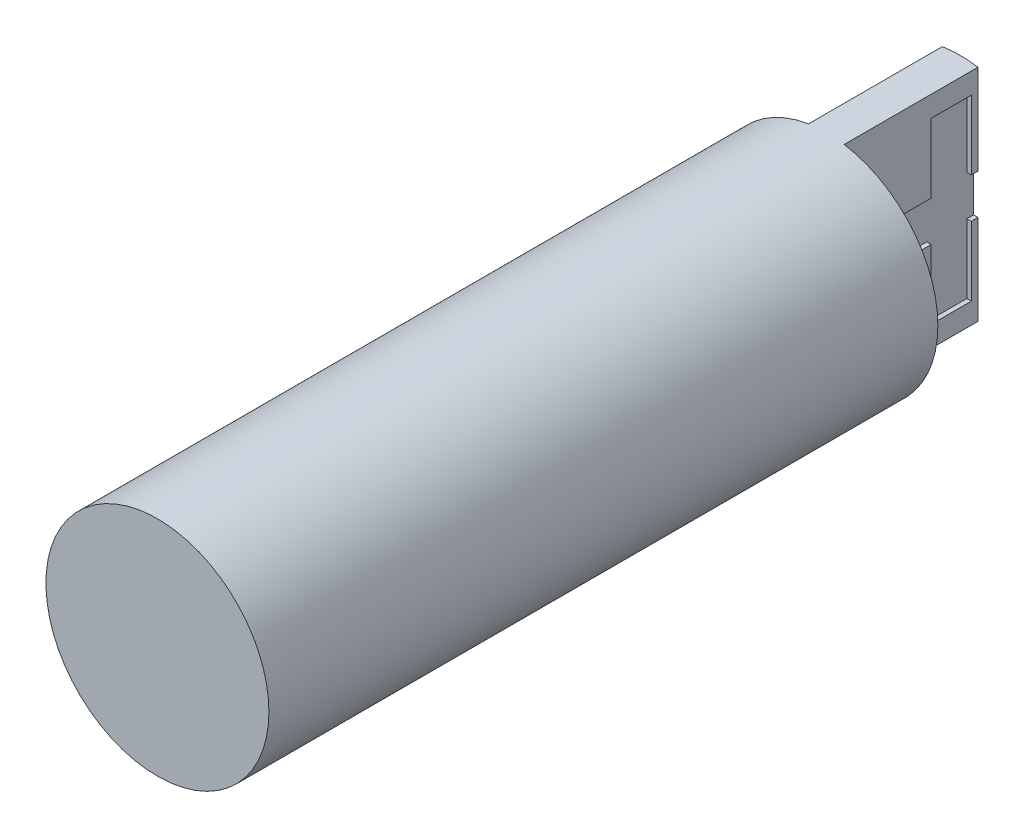
ISO-10303-21;
HEADER;
FILE_DESCRIPTION(('STEP AP214'),'2;1');
FILE_NAME('part.step','',(''),(''),'','','');
FILE_SCHEMA(('AUTOMOTIVE_DESIGN { 1 0 10303 214 1 1 1 1 }'));
ENDSEC;
DATA;
#1=APPLICATION_CONTEXT('core data for automotive mechanical design processes');
#2=APPLICATION_PROTOCOL_DEFINITION('international standard','automotive_design',2000,#1);
#3=PRODUCT_CONTEXT('',#1,'mechanical');
#4=PRODUCT('Part','Part','',(#3));
#5=PRODUCT_RELATED_PRODUCT_CATEGORY('part','',(#4));
#6=PRODUCT_DEFINITION_FORMATION('','',#4);
#7=PRODUCT_DEFINITION_CONTEXT('part definition',#1,'design');
#8=PRODUCT_DEFINITION('design','',#6,#7);
#9=PRODUCT_DEFINITION_SHAPE('','',#8);
#10=(LENGTH_UNIT() NAMED_UNIT(*) SI_UNIT(.MILLI.,.METRE.));
#11=(NAMED_UNIT(*) PLANE_ANGLE_UNIT() SI_UNIT($,.RADIAN.));
#12=(NAMED_UNIT(*) SI_UNIT($,.STERADIAN.) SOLID_ANGLE_UNIT());
#13=UNCERTAINTY_MEASURE_WITH_UNIT(LENGTH_MEASURE(1.E-05),#10,'distance_accuracy_value','');
#14=(GEOMETRIC_REPRESENTATION_CONTEXT(3) GLOBAL_UNCERTAINTY_ASSIGNED_CONTEXT((#13)) GLOBAL_UNIT_ASSIGNED_CONTEXT((#10,
#11,#12)) REPRESENTATION_CONTEXT('',''));
#15=CARTESIAN_POINT('',(0.,0.,0.));
#16=DIRECTION('',(0.,0.,1.));
#17=DIRECTION('',(1.,0.,0.));
#18=AXIS2_PLACEMENT_3D('',#15,#16,#17);
#19=CARTESIAN_POINT('',(0.,0.,0.));
#20=DIRECTION('',(0.,0.,1.));
#21=DIRECTION('',(1.,0.,0.));
#22=AXIS2_PLACEMENT_3D('',#19,#20,#21);
#23=PLANE('',#22);
#24=DIRECTION('',(0.,1.,0.));
#25=VECTOR('',#24,1.);
#26=CARTESIAN_POINT('',(-4.,-24.6779253585061,0.));
#27=LINE('',#26,#25);
#28=CARTESIAN_POINT('',(-4.,-24.6779253585061,0.));
#29=VERTEX_POINT('',#28);
#30=CARTESIAN_POINT('',(-4.,24.6779253585061,0.));
#31=VERTEX_POINT('',#30);
#32=EDGE_CURVE('E56',#29,#31,#27,.T.);
#33=ORIENTED_EDGE('',*,*,#32,.F.);
#34=CARTESIAN_POINT('',(0.,0.,0.));
#35=DIRECTION('',(0.,0.,1.));
#36=DIRECTION('',(1.,0.,0.));
#37=AXIS2_PLACEMENT_3D('',#34,#35,#36);
#38=CIRCLE('',#37,25.);
#39=EDGE_CURVE('E42',#31,#29,#38,.T.);
#40=ORIENTED_EDGE('',*,*,#39,.F.);
#41=EDGE_LOOP('',(#33,#40));
#42=FACE_BOUND('',#41,.T.);
#43=ADVANCED_FACE('F33',(#42),#23,.F.);
#44=DIRECTION('',(0.,-1.,0.));
#45=VECTOR('',#44,1.);
#46=CARTESIAN_POINT('',(4.,-24.6779253585061,0.));
#47=LINE('',#46,#45);
#48=CARTESIAN_POINT('',(4.,24.6779253585061,0.));
#49=VERTEX_POINT('',#48);
#50=CARTESIAN_POINT('',(4.00000000000001,-24.6779253585061,0.));
#51=VERTEX_POINT('',#50);
#52=EDGE_CURVE('E256',#49,#51,#47,.T.);
#53=ORIENTED_EDGE('',*,*,#52,.F.);
#54=EDGE_CURVE('E37',#51,#49,#38,.T.);
#55=ORIENTED_EDGE('',*,*,#54,.F.);
#56=EDGE_LOOP('',(#53,#55));
#57=FACE_BOUND('',#56,.T.);
#58=ADVANCED_FACE('F313',(#57),#23,.F.);
#59=CARTESIAN_POINT('',(0.,0.,150.));
#60=DIRECTION('',(0.,0.,-1.));
#61=DIRECTION('',(-1.,0.,0.));
#62=AXIS2_PLACEMENT_3D('',#59,#60,#61);
#63=CYLINDRICAL_SURFACE('',#62,25.);
#64=CARTESIAN_POINT('',(0.,0.,150.));
#65=DIRECTION('',(0.,0.,1.));
#66=DIRECTION('',(1.,0.,0.));
#67=AXIS2_PLACEMENT_3D('',#64,#65,#66);
#68=CIRCLE('',#67,25.);
#69=CARTESIAN_POINT('',(25.,0.,150.));
#70=VERTEX_POINT('',#69);
#71=EDGE_CURVE('E11',#70,#70,#68,.T.);
#72=ORIENTED_EDGE('',*,*,#71,.F.);
#73=EDGE_LOOP('',(#72));
#74=FACE_BOUND('',#73,.T.);
#75=ORIENTED_EDGE('',*,*,#54,.T.);
#76=DIRECTION('',(0.,0.,1.));
#77=VECTOR('',#76,1.);
#78=CARTESIAN_POINT('',(4.,24.6779253585061,-30.));
#79=LINE('',#78,#77);
#80=CARTESIAN_POINT('',(4.,24.6779253585061,-30.));
#81=VERTEX_POINT('',#80);
#82=EDGE_CURVE('E281',#81,#49,#79,.T.);
#83=ORIENTED_EDGE('',*,*,#82,.F.);
#84=CARTESIAN_POINT('',(0.,0.,-30.));
#85=DIRECTION('',(0.,0.,-1.));
#86=DIRECTION('',(-1.,0.,0.));
#87=AXIS2_PLACEMENT_3D('',#84,#85,#86);
#88=CIRCLE('',#87,25.);
#89=CARTESIAN_POINT('',(-4.,24.6779253585061,-30.));
#90=VERTEX_POINT('',#89);
#91=EDGE_CURVE('E257',#90,#81,#88,.T.);
#92=ORIENTED_EDGE('',*,*,#91,.F.);
#93=DIRECTION('',(0.,0.,1.));
#94=VECTOR('',#93,1.);
#95=CARTESIAN_POINT('',(-4.,24.6779253585061,-30.));
#96=LINE('',#95,#94);
#97=EDGE_CURVE('E269',#90,#31,#96,.T.);
#98=ORIENTED_EDGE('',*,*,#97,.T.);
#99=ORIENTED_EDGE('',*,*,#39,.T.);
#100=DIRECTION('',(0.,0.,1.));
#101=VECTOR('',#100,1.);
#102=CARTESIAN_POINT('',(-4.,-24.6779253585061,-30.));
#103=LINE('',#102,#101);
#104=CARTESIAN_POINT('',(-4.,-24.6779253585061,-30.));
#105=VERTEX_POINT('',#104);
#106=EDGE_CURVE('E275',#105,#29,#103,.T.);
#107=ORIENTED_EDGE('',*,*,#106,.F.);
#108=CARTESIAN_POINT('',(0.,0.,-30.));
#109=DIRECTION('',(0.,0.,-1.));
#110=DIRECTION('',(-1.,0.,0.));
#111=AXIS2_PLACEMENT_3D('',#108,#109,#110);
#112=CIRCLE('',#111,25.);
#113=CARTESIAN_POINT('',(4.00000000000001,-24.6779253585061,-30.));
#114=VERTEX_POINT('',#113);
#115=EDGE_CURVE('E264',#114,#105,#112,.T.);
#116=ORIENTED_EDGE('',*,*,#115,.F.);
#117=DIRECTION('',(0.,0.,1.));
#118=VECTOR('',#117,1.);
#119=CARTESIAN_POINT('',(4.00000000000001,-24.6779253585061,-30.));
#120=LINE('',#119,#118);
#121=EDGE_CURVE('E278',#114,#51,#120,.T.);
#122=ORIENTED_EDGE('',*,*,#121,.T.);
#123=EDGE_LOOP('',(#75,#83,#92,#98,#99,#107,#116,#122));
#124=FACE_BOUND('',#123,.T.);
#125=ADVANCED_FACE('F35',(#74,#124),#63,.T.);
#126=CARTESIAN_POINT('',(0.,0.,150.));
#127=DIRECTION('',(0.,0.,1.));
#128=DIRECTION('',(1.,0.,0.));
#129=AXIS2_PLACEMENT_3D('',#126,#127,#128);
#130=PLANE('',#129);
#131=ORIENTED_EDGE('',*,*,#71,.T.);
#132=EDGE_LOOP('',(#131));
#133=FACE_BOUND('',#132,.T.);
#134=ADVANCED_FACE('F319',(#133),#130,.T.);
#135=CARTESIAN_POINT('',(4.,-24.6779253585061,-30.));
#136=DIRECTION('',(-1.,0.,0.));
#137=DIRECTION('',(0.,0.,1.));
#138=AXIS2_PLACEMENT_3D('',#135,#136,#137);
#139=PLANE('',#138);
#140=DIRECTION('',(0.,1.,0.));
#141=VECTOR('',#140,1.);
#142=CARTESIAN_POINT('',(4.,4.5,-28.5));
#143=LINE('',#142,#141);
#144=CARTESIAN_POINT('',(4.,4.5,-28.5));
#145=VERTEX_POINT('',#144);
#146=CARTESIAN_POINT('',(4.,20.,-28.5));
#147=VERTEX_POINT('',#146);
#148=EDGE_CURVE('E220',#145,#147,#143,.T.);
#149=ORIENTED_EDGE('',*,*,#148,.F.);
#150=DIRECTION('',(0.,0.,1.));
#151=VECTOR('',#150,1.);
#152=CARTESIAN_POINT('',(4.,4.5,-28.5));
#153=LINE('',#152,#151);
#154=CARTESIAN_POINT('',(4.,4.5,-30.));
#155=VERTEX_POINT('',#154);
#156=EDGE_CURVE('E217',#155,#145,#153,.T.);
#157=ORIENTED_EDGE('',*,*,#156,.F.);
#158=DIRECTION('',(0.,-1.,0.));
#159=VECTOR('',#158,1.);
#160=CARTESIAN_POINT('',(4.,-24.6779253585061,-30.));
#161=LINE('',#160,#159);
#162=EDGE_CURVE('E261',#81,#155,#161,.T.);
#163=ORIENTED_EDGE('',*,*,#162,.F.);
#164=ORIENTED_EDGE('',*,*,#82,.T.);
#165=ORIENTED_EDGE('',*,*,#52,.T.);
#166=ORIENTED_EDGE('',*,*,#121,.F.);
#167=CARTESIAN_POINT('',(4.,-4.5,-30.));
#168=VERTEX_POINT('',#167);
#169=EDGE_CURVE('E260',#168,#114,#161,.T.);
#170=ORIENTED_EDGE('',*,*,#169,.F.);
#171=DIRECTION('',(0.,0.,-1.));
#172=VECTOR('',#171,1.);
#173=CARTESIAN_POINT('',(4.,-4.5,-28.5));
#174=LINE('',#173,#172);
#175=CARTESIAN_POINT('',(4.,-4.5,-28.5));
#176=VERTEX_POINT('',#175);
#177=EDGE_CURVE('E215',#176,#168,#174,.T.);
#178=ORIENTED_EDGE('',*,*,#177,.F.);
#179=DIRECTION('',(0.,1.,0.));
#180=VECTOR('',#179,1.);
#181=CARTESIAN_POINT('',(4.,-20.,-28.5));
#182=LINE('',#181,#180);
#183=CARTESIAN_POINT('',(4.,-20.,-28.5));
#184=VERTEX_POINT('',#183);
#185=EDGE_CURVE('E212',#184,#176,#182,.T.);
#186=ORIENTED_EDGE('',*,*,#185,.F.);
#187=DIRECTION('',(0.,0.,-1.));
#188=VECTOR('',#187,1.);
#189=CARTESIAN_POINT('',(4.,-20.,-28.5));
#190=LINE('',#189,#188);
#191=CARTESIAN_POINT('',(4.,-20.,-19.5));
#192=VERTEX_POINT('',#191);
#193=EDGE_CURVE('E209',#192,#184,#190,.T.);
#194=ORIENTED_EDGE('',*,*,#193,.F.);
#195=DIRECTION('',(0.,-1.,0.));
#196=VECTOR('',#195,1.);
#197=CARTESIAN_POINT('',(4.,-20.,-19.5));
#198=LINE('',#197,#196);
#199=CARTESIAN_POINT('',(4.,-4.5,-19.5));
#200=VERTEX_POINT('',#199);
#201=EDGE_CURVE('E206',#200,#192,#198,.T.);
#202=ORIENTED_EDGE('',*,*,#201,.F.);
#203=DIRECTION('',(0.,0.,-1.));
#204=VECTOR('',#203,1.);
#205=CARTESIAN_POINT('',(4.,-4.5,-4.));
#206=LINE('',#205,#204);
#207=CARTESIAN_POINT('',(4.,-4.5,-4.));
#208=VERTEX_POINT('',#207);
#209=EDGE_CURVE('E204',#208,#200,#206,.T.);
#210=ORIENTED_EDGE('',*,*,#209,.F.);
#211=DIRECTION('',(0.,-1.,0.));
#212=VECTOR('',#211,1.);
#213=CARTESIAN_POINT('',(4.,4.5,-4.));
#214=LINE('',#213,#212);
#215=CARTESIAN_POINT('',(4.,4.5,-4.));
#216=VERTEX_POINT('',#215);
#217=EDGE_CURVE('E159',#216,#208,#214,.T.);
#218=ORIENTED_EDGE('',*,*,#217,.F.);
#219=DIRECTION('',(0.,0.,1.));
#220=VECTOR('',#219,1.);
#221=CARTESIAN_POINT('',(4.,4.5,-4.));
#222=LINE('',#221,#220);
#223=CARTESIAN_POINT('',(4.,4.5,-19.5));
#224=VERTEX_POINT('',#223);
#225=EDGE_CURVE('E176',#224,#216,#222,.T.);
#226=ORIENTED_EDGE('',*,*,#225,.F.);
#227=DIRECTION('',(0.,-1.,0.));
#228=VECTOR('',#227,1.);
#229=CARTESIAN_POINT('',(4.,4.5,-19.5));
#230=LINE('',#229,#228);
#231=CARTESIAN_POINT('',(4.,20.,-19.5));
#232=VERTEX_POINT('',#231);
#233=EDGE_CURVE('E179',#232,#224,#230,.T.);
#234=ORIENTED_EDGE('',*,*,#233,.F.);
#235=DIRECTION('',(0.,0.,1.));
#236=VECTOR('',#235,1.);
#237=CARTESIAN_POINT('',(4.,20.,-28.5));
#238=LINE('',#237,#236);
#239=EDGE_CURVE('E223',#147,#232,#238,.T.);
#240=ORIENTED_EDGE('',*,*,#239,.F.);
#241=EDGE_LOOP('',(#149,#157,#163,#164,#165,#166,#170,#178,#186,#194,#202,#210,#218,#226,#234,#240));
#242=FACE_BOUND('',#241,.T.);
#243=ADVANCED_FACE('F302',(#242),#139,.F.);
#244=CARTESIAN_POINT('',(-4.,-24.6779253585061,-30.));
#245=DIRECTION('',(1.,0.,0.));
#246=DIRECTION('',(0.,0.,-1.));
#247=AXIS2_PLACEMENT_3D('',#244,#245,#246);
#248=PLANE('',#247);
#249=DIRECTION('',(0.,1.,0.));
#250=VECTOR('',#249,1.);
#251=CARTESIAN_POINT('',(-4.,-24.6779253585061,-30.));
#252=LINE('',#251,#250);
#253=CARTESIAN_POINT('',(-4.,0.,-30.));
#254=VERTEX_POINT('',#253);
#255=EDGE_CURVE('E266',#254,#90,#252,.T.);
#256=ORIENTED_EDGE('',*,*,#255,.F.);
#257=CARTESIAN_POINT('',(-4.,0.,-24.));
#258=DIRECTION('',(-1.,0.,0.));
#259=DIRECTION('',(0.,0.,1.));
#260=AXIS2_PLACEMENT_3D('',#257,#258,#259);
#261=CIRCLE('',#260,6.);
#262=EDGE_CURVE('E230',#254,#254,#261,.T.);
#263=ORIENTED_EDGE('',*,*,#262,.F.);
#264=EDGE_CURVE('E267',#105,#254,#252,.T.);
#265=ORIENTED_EDGE('',*,*,#264,.F.);
#266=ORIENTED_EDGE('',*,*,#106,.T.);
#267=ORIENTED_EDGE('',*,*,#32,.T.);
#268=ORIENTED_EDGE('',*,*,#97,.F.);
#269=EDGE_LOOP('',(#256,#263,#265,#266,#267,#268));
#270=FACE_BOUND('',#269,.T.);
#271=ADVANCED_FACE('F294',(#270),#248,.F.);
#272=CARTESIAN_POINT('',(0.,0.,-30.));
#273=DIRECTION('',(0.,0.,-1.));
#274=DIRECTION('',(-1.,0.,0.));
#275=AXIS2_PLACEMENT_3D('',#272,#273,#274);
#276=PLANE('',#275);
#277=DIRECTION('',(1.,0.,0.));
#278=VECTOR('',#277,1.);
#279=CARTESIAN_POINT('',(3.,4.5,-30.));
#280=LINE('',#279,#278);
#281=CARTESIAN_POINT('',(3.,4.5,-30.));
#282=VERTEX_POINT('',#281);
#283=EDGE_CURVE('E239',#282,#155,#280,.T.);
#284=ORIENTED_EDGE('',*,*,#283,.F.);
#285=DIRECTION('',(0.,1.,0.));
#286=VECTOR('',#285,1.);
#287=CARTESIAN_POINT('',(3.,4.5,-30.));
#288=LINE('',#287,#286);
#289=CARTESIAN_POINT('',(3.,-4.5,-30.));
#290=VERTEX_POINT('',#289);
#291=EDGE_CURVE('E189',#290,#282,#288,.T.);
#292=ORIENTED_EDGE('',*,*,#291,.F.);
#293=DIRECTION('',(1.,0.,0.));
#294=VECTOR('',#293,1.);
#295=CARTESIAN_POINT('',(3.,-4.5,-30.));
#296=LINE('',#295,#294);
#297=EDGE_CURVE('E241',#290,#168,#296,.T.);
#298=ORIENTED_EDGE('',*,*,#297,.T.);
#299=ORIENTED_EDGE('',*,*,#169,.T.);
#300=ORIENTED_EDGE('',*,*,#115,.T.);
#301=ORIENTED_EDGE('',*,*,#264,.T.);
#302=ORIENTED_EDGE('',*,*,#255,.T.);
#303=ORIENTED_EDGE('',*,*,#91,.T.);
#304=ORIENTED_EDGE('',*,*,#162,.T.);
#305=EDGE_LOOP('',(#284,#292,#298,#299,#300,#301,#302,#303,#304));
#306=FACE_BOUND('',#305,.T.);
#307=ADVANCED_FACE('F298',(#306),#276,.T.);
#308=CARTESIAN_POINT('',(-4.,0.,-24.));
#309=DIRECTION('',(1.,0.,0.));
#310=DIRECTION('',(0.,0.,1.));
#311=AXIS2_PLACEMENT_3D('',#308,#309,#310);
#312=CONICAL_SURFACE('',#311,6.,0.0174532925199433);
#313=CARTESIAN_POINT('',(-13.,0.,-24.));
#314=DIRECTION('',(-1.,0.,0.));
#315=DIRECTION('',(0.,0.,1.));
#316=AXIS2_PLACEMENT_3D('',#313,#314,#315);
#317=CIRCLE('',#316,5.84290441564604);
#318=CARTESIAN_POINT('',(-13.,0.,-18.157095584354));
#319=VERTEX_POINT('',#318);
#320=EDGE_CURVE('E253',#319,#319,#317,.T.);
#321=ORIENTED_EDGE('',*,*,#320,.F.);
#322=EDGE_LOOP('',(#321));
#323=FACE_BOUND('',#322,.T.);
#324=ORIENTED_EDGE('',*,*,#262,.T.);
#325=EDGE_LOOP('',(#324));
#326=FACE_BOUND('',#325,.T.);
#327=ADVANCED_FACE('F331',(#323,#326),#312,.T.);
#328=CARTESIAN_POINT('',(-13.,0.,-24.));
#329=DIRECTION('',(-1.,0.,0.));
#330=DIRECTION('',(0.,0.,1.));
#331=AXIS2_PLACEMENT_3D('',#328,#329,#330);
#332=PLANE('',#331);
#333=ORIENTED_EDGE('',*,*,#320,.T.);
#334=EDGE_LOOP('',(#333));
#335=FACE_BOUND('',#334,.T.);
#336=ADVANCED_FACE('F334',(#335),#332,.T.);
#337=CARTESIAN_POINT('',(3.,4.5,-4.));
#338=DIRECTION('',(0.,0.,1.));
#339=DIRECTION('',(1.,0.,0.));
#340=AXIS2_PLACEMENT_3D('',#337,#338,#339);
#341=PLANE('',#340);
#342=ORIENTED_EDGE('',*,*,#217,.T.);
#343=DIRECTION('',(1.,0.,0.));
#344=VECTOR('',#343,1.);
#345=CARTESIAN_POINT('',(3.,-4.5,-4.));
#346=LINE('',#345,#344);
#347=CARTESIAN_POINT('',(3.,-4.5,-4.));
#348=VERTEX_POINT('',#347);
#349=EDGE_CURVE('E152',#348,#208,#346,.T.);
#350=ORIENTED_EDGE('',*,*,#349,.F.);
#351=DIRECTION('',(0.,-1.,0.));
#352=VECTOR('',#351,1.);
#353=CARTESIAN_POINT('',(3.,4.5,-4.));
#354=LINE('',#353,#352);
#355=CARTESIAN_POINT('',(3.,4.5,-4.));
#356=VERTEX_POINT('',#355);
#357=EDGE_CURVE('E156',#356,#348,#354,.T.);
#358=ORIENTED_EDGE('',*,*,#357,.F.);
#359=DIRECTION('',(1.,0.,0.));
#360=VECTOR('',#359,1.);
#361=CARTESIAN_POINT('',(3.,4.5,-4.));
#362=LINE('',#361,#360);
#363=EDGE_CURVE('E228',#356,#216,#362,.T.);
#364=ORIENTED_EDGE('',*,*,#363,.T.);
#365=EDGE_LOOP('',(#342,#350,#358,#364));
#366=FACE_BOUND('',#365,.T.);
#367=ADVANCED_FACE('F154',(#366),#341,.F.);
#368=CARTESIAN_POINT('',(3.,4.5,-4.));
#369=DIRECTION('',(0.,1.,0.));
#370=DIRECTION('',(0.,0.,1.));
#371=AXIS2_PLACEMENT_3D('',#368,#369,#370);
#372=PLANE('',#371);
#373=ORIENTED_EDGE('',*,*,#225,.T.);
#374=ORIENTED_EDGE('',*,*,#363,.F.);
#375=DIRECTION('',(0.,0.,1.));
#376=VECTOR('',#375,1.);
#377=CARTESIAN_POINT('',(3.,4.5,-4.));
#378=LINE('',#377,#376);
#379=CARTESIAN_POINT('',(3.,4.5,-19.5));
#380=VERTEX_POINT('',#379);
#381=EDGE_CURVE('E164',#380,#356,#378,.T.);
#382=ORIENTED_EDGE('',*,*,#381,.F.);
#383=DIRECTION('',(1.,0.,0.));
#384=VECTOR('',#383,1.);
#385=CARTESIAN_POINT('',(3.,4.5,-19.5));
#386=LINE('',#385,#384);
#387=EDGE_CURVE('E231',#380,#224,#386,.T.);
#388=ORIENTED_EDGE('',*,*,#387,.T.);
#389=EDGE_LOOP('',(#373,#374,#382,#388));
#390=FACE_BOUND('',#389,.T.);
#391=ADVANCED_FACE('F341',(#390),#372,.F.);
#392=CARTESIAN_POINT('',(3.,4.5,-19.5));
#393=DIRECTION('',(0.,0.,1.));
#394=DIRECTION('',(1.,0.,0.));
#395=AXIS2_PLACEMENT_3D('',#392,#393,#394);
#396=PLANE('',#395);
#397=ORIENTED_EDGE('',*,*,#233,.T.);
#398=ORIENTED_EDGE('',*,*,#387,.F.);
#399=DIRECTION('',(0.,-1.,0.));
#400=VECTOR('',#399,1.);
#401=CARTESIAN_POINT('',(3.,4.5,-19.5));
#402=LINE('',#401,#400);
#403=CARTESIAN_POINT('',(3.,20.,-19.5));
#404=VERTEX_POINT('',#403);
#405=EDGE_CURVE('E200',#404,#380,#402,.T.);
#406=ORIENTED_EDGE('',*,*,#405,.F.);
#407=DIRECTION('',(1.,0.,0.));
#408=VECTOR('',#407,1.);
#409=CARTESIAN_POINT('',(3.,20.,-19.5));
#410=LINE('',#409,#408);
#411=EDGE_CURVE('E233',#404,#232,#410,.T.);
#412=ORIENTED_EDGE('',*,*,#411,.T.);
#413=EDGE_LOOP('',(#397,#398,#406,#412));
#414=FACE_BOUND('',#413,.T.);
#415=ADVANCED_FACE('F368',(#414),#396,.F.);
#416=CARTESIAN_POINT('',(3.,20.,-28.5));
#417=DIRECTION('',(0.,1.,0.));
#418=DIRECTION('',(0.,0.,1.));
#419=AXIS2_PLACEMENT_3D('',#416,#417,#418);
#420=PLANE('',#419);
#421=ORIENTED_EDGE('',*,*,#239,.T.);
#422=ORIENTED_EDGE('',*,*,#411,.F.);
#423=DIRECTION('',(0.,0.,1.));
#424=VECTOR('',#423,1.);
#425=CARTESIAN_POINT('',(3.,20.,-28.5));
#426=LINE('',#425,#424);
#427=CARTESIAN_POINT('',(3.,20.,-28.5));
#428=VERTEX_POINT('',#427);
#429=EDGE_CURVE('E197',#428,#404,#426,.T.);
#430=ORIENTED_EDGE('',*,*,#429,.F.);
#431=DIRECTION('',(1.,0.,0.));
#432=VECTOR('',#431,1.);
#433=CARTESIAN_POINT('',(3.,20.,-28.5));
#434=LINE('',#433,#432);
#435=EDGE_CURVE('E235',#428,#147,#434,.T.);
#436=ORIENTED_EDGE('',*,*,#435,.T.);
#437=EDGE_LOOP('',(#421,#422,#430,#436));
#438=FACE_BOUND('',#437,.T.);
#439=ADVANCED_FACE('F364',(#438),#420,.F.);
#440=CARTESIAN_POINT('',(3.,4.5,-28.5));
#441=DIRECTION('',(0.,0.,-1.));
#442=DIRECTION('',(0.,1.,0.));
#443=AXIS2_PLACEMENT_3D('',#440,#441,#442);
#444=PLANE('',#443);
#445=ORIENTED_EDGE('',*,*,#148,.T.);
#446=ORIENTED_EDGE('',*,*,#435,.F.);
#447=DIRECTION('',(0.,1.,0.));
#448=VECTOR('',#447,1.);
#449=CARTESIAN_POINT('',(3.,4.5,-28.5));
#450=LINE('',#449,#448);
#451=CARTESIAN_POINT('',(3.,4.5,-28.5));
#452=VERTEX_POINT('',#451);
#453=EDGE_CURVE('E194',#452,#428,#450,.T.);
#454=ORIENTED_EDGE('',*,*,#453,.F.);
#455=DIRECTION('',(1.,0.,0.));
#456=VECTOR('',#455,1.);
#457=CARTESIAN_POINT('',(3.,4.5,-28.5));
#458=LINE('',#457,#456);
#459=EDGE_CURVE('E237',#452,#145,#458,.T.);
#460=ORIENTED_EDGE('',*,*,#459,.T.);
#461=EDGE_LOOP('',(#445,#446,#454,#460));
#462=FACE_BOUND('',#461,.T.);
#463=ADVANCED_FACE('F361',(#462),#444,.F.);
#464=CARTESIAN_POINT('',(3.,4.5,-28.5));
#465=DIRECTION('',(0.,1.,0.));
#466=DIRECTION('',(0.,0.,1.));
#467=AXIS2_PLACEMENT_3D('',#464,#465,#466);
#468=PLANE('',#467);
#469=ORIENTED_EDGE('',*,*,#156,.T.);
#470=ORIENTED_EDGE('',*,*,#459,.F.);
#471=DIRECTION('',(0.,0.,1.));
#472=VECTOR('',#471,1.);
#473=CARTESIAN_POINT('',(3.,4.5,-28.5));
#474=LINE('',#473,#472);
#475=EDGE_CURVE('E191',#282,#452,#474,.T.);
#476=ORIENTED_EDGE('',*,*,#475,.F.);
#477=ORIENTED_EDGE('',*,*,#283,.T.);
#478=EDGE_LOOP('',(#469,#470,#476,#477));
#479=FACE_BOUND('',#478,.T.);
#480=ADVANCED_FACE('F305',(#479),#468,.F.);
#481=CARTESIAN_POINT('',(3.,-4.5,-28.5));
#482=DIRECTION('',(0.,-1.,0.));
#483=DIRECTION('',(0.,0.,-1.));
#484=AXIS2_PLACEMENT_3D('',#481,#482,#483);
#485=PLANE('',#484);
#486=ORIENTED_EDGE('',*,*,#177,.T.);
#487=ORIENTED_EDGE('',*,*,#297,.F.);
#488=DIRECTION('',(0.,0.,-1.));
#489=VECTOR('',#488,1.);
#490=CARTESIAN_POINT('',(3.,-4.5,-28.5));
#491=LINE('',#490,#489);
#492=CARTESIAN_POINT('',(3.,-4.5,-28.5));
#493=VERTEX_POINT('',#492);
#494=EDGE_CURVE('E49',#493,#290,#491,.T.);
#495=ORIENTED_EDGE('',*,*,#494,.F.);
#496=DIRECTION('',(1.,0.,0.));
#497=VECTOR('',#496,1.);
#498=CARTESIAN_POINT('',(3.,-4.5,-28.5));
#499=LINE('',#498,#497);
#500=EDGE_CURVE('E244',#493,#176,#499,.T.);
#501=ORIENTED_EDGE('',*,*,#500,.T.);
#502=EDGE_LOOP('',(#486,#487,#495,#501));
#503=FACE_BOUND('',#502,.T.);
#504=ADVANCED_FACE('F355',(#503),#485,.F.);
#505=CARTESIAN_POINT('',(3.,-20.,-28.5));
#506=DIRECTION('',(0.,0.,-1.));
#507=DIRECTION('',(0.,1.,0.));
#508=AXIS2_PLACEMENT_3D('',#505,#506,#507);
#509=PLANE('',#508);
#510=ORIENTED_EDGE('',*,*,#185,.T.);
#511=ORIENTED_EDGE('',*,*,#500,.F.);
#512=DIRECTION('',(0.,1.,0.));
#513=VECTOR('',#512,1.);
#514=CARTESIAN_POINT('',(3.,-20.,-28.5));
#515=LINE('',#514,#513);
#516=CARTESIAN_POINT('',(3.,-20.,-28.5));
#517=VERTEX_POINT('',#516);
#518=EDGE_CURVE('E186',#517,#493,#515,.T.);
#519=ORIENTED_EDGE('',*,*,#518,.F.);
#520=DIRECTION('',(1.,0.,0.));
#521=VECTOR('',#520,1.);
#522=CARTESIAN_POINT('',(3.,-20.,-28.5));
#523=LINE('',#522,#521);
#524=EDGE_CURVE('E246',#517,#184,#523,.T.);
#525=ORIENTED_EDGE('',*,*,#524,.T.);
#526=EDGE_LOOP('',(#510,#511,#519,#525));
#527=FACE_BOUND('',#526,.T.);
#528=ADVANCED_FACE('F351',(#527),#509,.F.);
#529=CARTESIAN_POINT('',(3.,-20.,-28.5));
#530=DIRECTION('',(0.,-1.,0.));
#531=DIRECTION('',(0.,0.,-1.));
#532=AXIS2_PLACEMENT_3D('',#529,#530,#531);
#533=PLANE('',#532);
#534=ORIENTED_EDGE('',*,*,#193,.T.);
#535=ORIENTED_EDGE('',*,*,#524,.F.);
#536=DIRECTION('',(0.,0.,-1.));
#537=VECTOR('',#536,1.);
#538=CARTESIAN_POINT('',(3.,-20.,-28.5));
#539=LINE('',#538,#537);
#540=CARTESIAN_POINT('',(3.,-20.,-19.5));
#541=VERTEX_POINT('',#540);
#542=EDGE_CURVE('E183',#541,#517,#539,.T.);
#543=ORIENTED_EDGE('',*,*,#542,.F.);
#544=DIRECTION('',(1.,0.,0.));
#545=VECTOR('',#544,1.);
#546=CARTESIAN_POINT('',(3.,-20.,-19.5));
#547=LINE('',#546,#545);
#548=EDGE_CURVE('E248',#541,#192,#547,.T.);
#549=ORIENTED_EDGE('',*,*,#548,.T.);
#550=EDGE_LOOP('',(#534,#535,#543,#549));
#551=FACE_BOUND('',#550,.T.);
#552=ADVANCED_FACE('F347',(#551),#533,.F.);
#553=CARTESIAN_POINT('',(3.,-20.,-19.5));
#554=DIRECTION('',(0.,0.,1.));
#555=DIRECTION('',(1.,0.,0.));
#556=AXIS2_PLACEMENT_3D('',#553,#554,#555);
#557=PLANE('',#556);
#558=ORIENTED_EDGE('',*,*,#201,.T.);
#559=ORIENTED_EDGE('',*,*,#548,.F.);
#560=DIRECTION('',(0.,-1.,0.));
#561=VECTOR('',#560,1.);
#562=CARTESIAN_POINT('',(3.,-20.,-19.5));
#563=LINE('',#562,#561);
#564=CARTESIAN_POINT('',(3.,-4.5,-19.5));
#565=VERTEX_POINT('',#564);
#566=EDGE_CURVE('E171',#565,#541,#563,.T.);
#567=ORIENTED_EDGE('',*,*,#566,.F.);
#568=DIRECTION('',(1.,0.,0.));
#569=VECTOR('',#568,1.);
#570=CARTESIAN_POINT('',(3.,-4.5,-19.5));
#571=LINE('',#570,#569);
#572=EDGE_CURVE('E163',#565,#200,#571,.T.);
#573=ORIENTED_EDGE('',*,*,#572,.T.);
#574=EDGE_LOOP('',(#558,#559,#567,#573));
#575=FACE_BOUND('',#574,.T.);
#576=ADVANCED_FACE('F344',(#575),#557,.F.);
#577=CARTESIAN_POINT('',(3.,-4.5,-4.));
#578=DIRECTION('',(0.,-1.,0.));
#579=DIRECTION('',(0.,0.,-1.));
#580=AXIS2_PLACEMENT_3D('',#577,#578,#579);
#581=PLANE('',#580);
#582=ORIENTED_EDGE('',*,*,#209,.T.);
#583=ORIENTED_EDGE('',*,*,#572,.F.);
#584=DIRECTION('',(0.,0.,-1.));
#585=VECTOR('',#584,1.);
#586=CARTESIAN_POINT('',(3.,-4.5,-4.));
#587=LINE('',#586,#585);
#588=EDGE_CURVE('E167',#348,#565,#587,.T.);
#589=ORIENTED_EDGE('',*,*,#588,.F.);
#590=ORIENTED_EDGE('',*,*,#349,.T.);
#591=EDGE_LOOP('',(#582,#583,#589,#590));
#592=FACE_BOUND('',#591,.T.);
#593=ADVANCED_FACE('F168',(#592),#581,.F.);
#594=CARTESIAN_POINT('',(3.,0.,0.));
#595=DIRECTION('',(1.,0.,0.));
#596=DIRECTION('',(0.,0.,-1.));
#597=AXIS2_PLACEMENT_3D('',#594,#595,#596);
#598=PLANE('',#597);
#599=ORIENTED_EDGE('',*,*,#357,.T.);
#600=ORIENTED_EDGE('',*,*,#588,.T.);
#601=ORIENTED_EDGE('',*,*,#566,.T.);
#602=ORIENTED_EDGE('',*,*,#542,.T.);
#603=ORIENTED_EDGE('',*,*,#518,.T.);
#604=ORIENTED_EDGE('',*,*,#494,.T.);
#605=ORIENTED_EDGE('',*,*,#291,.T.);
#606=ORIENTED_EDGE('',*,*,#475,.T.);
#607=ORIENTED_EDGE('',*,*,#453,.T.);
#608=ORIENTED_EDGE('',*,*,#429,.T.);
#609=ORIENTED_EDGE('',*,*,#405,.T.);
#610=ORIENTED_EDGE('',*,*,#381,.T.);
#611=EDGE_LOOP('',(#599,#600,#601,#602,#603,#604,#605,#606,#607,#608,#609,#610));
#612=FACE_BOUND('',#611,.T.);
#613=ADVANCED_FACE('F173',(#612),#598,.T.);
#614=CLOSED_SHELL('',(#43,#58,#125,#134,#243,#271,#307,#327,#336,#367,#391,#415,#439,#463,#480,
#504,#528,#552,#576,#593,#613));
#615=MANIFOLD_SOLID_BREP('B2',#614);
#616=ADVANCED_BREP_SHAPE_REPRESENTATION('',(#18,#615),#14);
#617=SHAPE_DEFINITION_REPRESENTATION(#9,#616);
ENDSEC;
END-ISO-10303-21;
